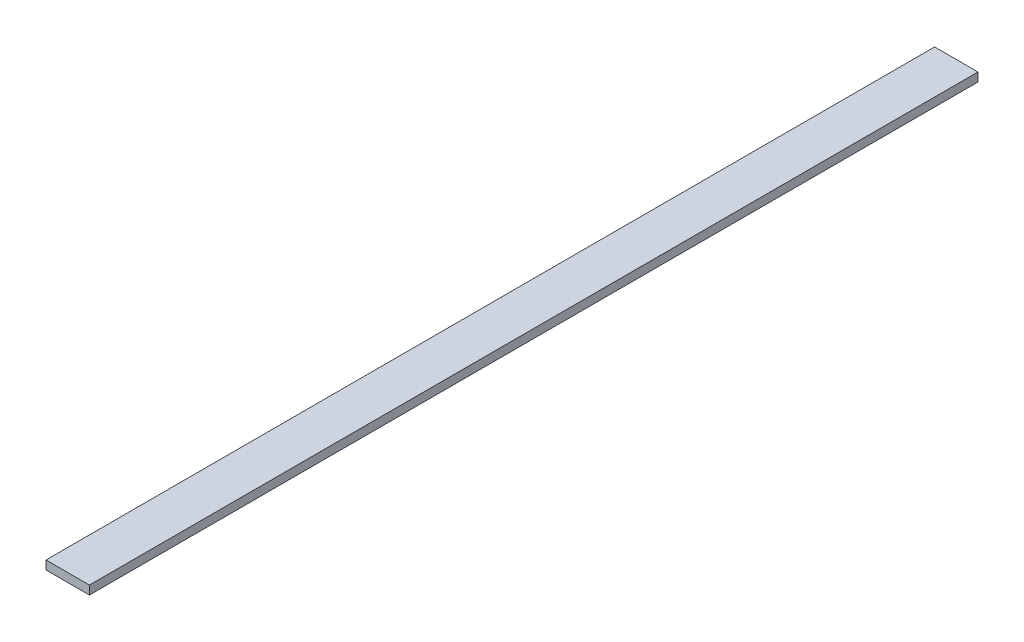
ISO-10303-21;
HEADER;
FILE_DESCRIPTION(('STEP AP214'),'2;1');
FILE_NAME('part.step','',(''),(''),'','','');
FILE_SCHEMA(('AUTOMOTIVE_DESIGN { 1 0 10303 214 1 1 1 1 }'));
ENDSEC;
DATA;
#1=APPLICATION_CONTEXT('core data for automotive mechanical design processes');
#2=APPLICATION_PROTOCOL_DEFINITION('international standard','automotive_design',2000,#1);
#3=PRODUCT_CONTEXT('',#1,'mechanical');
#4=PRODUCT('Part','Part','',(#3));
#5=PRODUCT_RELATED_PRODUCT_CATEGORY('part','',(#4));
#6=PRODUCT_DEFINITION_FORMATION('','',#4);
#7=PRODUCT_DEFINITION_CONTEXT('part definition',#1,'design');
#8=PRODUCT_DEFINITION('design','',#6,#7);
#9=PRODUCT_DEFINITION_SHAPE('','',#8);
#10=(LENGTH_UNIT() NAMED_UNIT(*) SI_UNIT(.MILLI.,.METRE.));
#11=(NAMED_UNIT(*) PLANE_ANGLE_UNIT() SI_UNIT($,.RADIAN.));
#12=(NAMED_UNIT(*) SI_UNIT($,.STERADIAN.) SOLID_ANGLE_UNIT());
#13=UNCERTAINTY_MEASURE_WITH_UNIT(LENGTH_MEASURE(1.E-05),#10,'distance_accuracy_value','');
#14=(GEOMETRIC_REPRESENTATION_CONTEXT(3) GLOBAL_UNCERTAINTY_ASSIGNED_CONTEXT((#13)) GLOBAL_UNIT_ASSIGNED_CONTEXT((#10,
#11,#12)) REPRESENTATION_CONTEXT('',''));
#15=CARTESIAN_POINT('',(0.,0.,0.));
#16=DIRECTION('',(0.,0.,1.));
#17=DIRECTION('',(1.,0.,0.));
#18=AXIS2_PLACEMENT_3D('',#15,#16,#17);
#19=CARTESIAN_POINT('',(9.99999999999997,4.,-204.7875));
#20=DIRECTION('',(-1.,0.,0.));
#21=DIRECTION('',(0.,0.,1.));
#22=AXIS2_PLACEMENT_3D('',#19,#20,#21);
#23=PLANE('',#22);
#24=DIRECTION('',(0.,0.,-1.));
#25=VECTOR('',#24,1.);
#26=CARTESIAN_POINT('',(9.99999999999997,0.,-204.7875));
#27=LINE('',#26,#25);
#28=CARTESIAN_POINT('',(10.,0.,204.7875));
#29=VERTEX_POINT('',#28);
#30=CARTESIAN_POINT('',(9.99999999999997,0.,-204.7875));
#31=VERTEX_POINT('',#30);
#32=EDGE_CURVE('E108',#29,#31,#27,.T.);
#33=ORIENTED_EDGE('',*,*,#32,.T.);
#34=DIRECTION('',(0.,-1.,0.));
#35=VECTOR('',#34,1.);
#36=CARTESIAN_POINT('',(9.99999999999997,4.,-204.7875));
#37=LINE('',#36,#35);
#38=CARTESIAN_POINT('',(9.99999999999997,4.,-204.7875));
#39=VERTEX_POINT('',#38);
#40=EDGE_CURVE('E11',#39,#31,#37,.T.);
#41=ORIENTED_EDGE('',*,*,#40,.F.);
#42=DIRECTION('',(0.,0.,-1.));
#43=VECTOR('',#42,1.);
#44=CARTESIAN_POINT('',(9.99999999999997,4.,-204.7875));
#45=LINE('',#44,#43);
#46=CARTESIAN_POINT('',(10.,4.,204.7875));
#47=VERTEX_POINT('',#46);
#48=EDGE_CURVE('E96',#47,#39,#45,.T.);
#49=ORIENTED_EDGE('',*,*,#48,.F.);
#50=DIRECTION('',(0.,-1.,0.));
#51=VECTOR('',#50,1.);
#52=CARTESIAN_POINT('',(10.,4.,204.7875));
#53=LINE('',#52,#51);
#54=EDGE_CURVE('E104',#47,#29,#53,.T.);
#55=ORIENTED_EDGE('',*,*,#54,.T.);
#56=EDGE_LOOP('',(#33,#41,#49,#55));
#57=FACE_BOUND('',#56,.T.);
#58=ADVANCED_FACE('F45',(#57),#23,.F.);
#59=CARTESIAN_POINT('',(-10.,4.,-204.7875));
#60=DIRECTION('',(0.,0.,1.));
#61=DIRECTION('',(1.,0.,0.));
#62=AXIS2_PLACEMENT_3D('',#59,#60,#61);
#63=PLANE('',#62);
#64=DIRECTION('',(-1.,0.,0.));
#65=VECTOR('',#64,1.);
#66=CARTESIAN_POINT('',(-10.,0.,-204.7875));
#67=LINE('',#66,#65);
#68=CARTESIAN_POINT('',(-10.,0.,-204.7875));
#69=VERTEX_POINT('',#68);
#70=EDGE_CURVE('E100',#31,#69,#67,.T.);
#71=ORIENTED_EDGE('',*,*,#70,.T.);
#72=DIRECTION('',(0.,-1.,0.));
#73=VECTOR('',#72,1.);
#74=CARTESIAN_POINT('',(-10.,4.,-204.7875));
#75=LINE('',#74,#73);
#76=CARTESIAN_POINT('',(-10.,4.,-204.7875));
#77=VERTEX_POINT('',#76);
#78=EDGE_CURVE('E53',#77,#69,#75,.T.);
#79=ORIENTED_EDGE('',*,*,#78,.F.);
#80=DIRECTION('',(-1.,0.,0.));
#81=VECTOR('',#80,1.);
#82=CARTESIAN_POINT('',(-10.,4.,-204.7875));
#83=LINE('',#82,#81);
#84=EDGE_CURVE('E91',#39,#77,#83,.T.);
#85=ORIENTED_EDGE('',*,*,#84,.F.);
#86=ORIENTED_EDGE('',*,*,#40,.T.);
#87=EDGE_LOOP('',(#71,#79,#85,#86));
#88=FACE_BOUND('',#87,.T.);
#89=ADVANCED_FACE('F99',(#88),#63,.F.);
#90=CARTESIAN_POINT('',(-10.,4.,-204.7875));
#91=DIRECTION('',(1.,0.,0.));
#92=DIRECTION('',(0.,0.,-1.));
#93=AXIS2_PLACEMENT_3D('',#90,#91,#92);
#94=PLANE('',#93);
#95=DIRECTION('',(0.,0.,1.));
#96=VECTOR('',#95,1.);
#97=CARTESIAN_POINT('',(-10.,0.,-204.7875));
#98=LINE('',#97,#96);
#99=CARTESIAN_POINT('',(-9.99999999999998,0.,204.7875));
#100=VERTEX_POINT('',#99);
#101=EDGE_CURVE('E78',#69,#100,#98,.T.);
#102=ORIENTED_EDGE('',*,*,#101,.T.);
#103=DIRECTION('',(0.,-1.,0.));
#104=VECTOR('',#103,1.);
#105=CARTESIAN_POINT('',(-9.99999999999998,4.,204.7875));
#106=LINE('',#105,#104);
#107=CARTESIAN_POINT('',(-9.99999999999998,4.,204.7875));
#108=VERTEX_POINT('',#107);
#109=EDGE_CURVE('E101',#108,#100,#106,.T.);
#110=ORIENTED_EDGE('',*,*,#109,.F.);
#111=DIRECTION('',(0.,0.,1.));
#112=VECTOR('',#111,1.);
#113=CARTESIAN_POINT('',(-10.,4.,-204.7875));
#114=LINE('',#113,#112);
#115=EDGE_CURVE('E94',#77,#108,#114,.T.);
#116=ORIENTED_EDGE('',*,*,#115,.F.);
#117=ORIENTED_EDGE('',*,*,#78,.T.);
#118=EDGE_LOOP('',(#102,#110,#116,#117));
#119=FACE_BOUND('',#118,.T.);
#120=ADVANCED_FACE('F102',(#119),#94,.F.);
#121=CARTESIAN_POINT('',(-9.99999999999998,4.,204.7875));
#122=DIRECTION('',(0.,0.,-1.));
#123=DIRECTION('',(-1.,0.,0.));
#124=AXIS2_PLACEMENT_3D('',#121,#122,#123);
#125=PLANE('',#124);
#126=DIRECTION('',(1.,0.,0.));
#127=VECTOR('',#126,1.);
#128=CARTESIAN_POINT('',(-9.99999999999998,0.,204.7875));
#129=LINE('',#128,#127);
#130=EDGE_CURVE('E84',#100,#29,#129,.T.);
#131=ORIENTED_EDGE('',*,*,#130,.T.);
#132=ORIENTED_EDGE('',*,*,#54,.F.);
#133=DIRECTION('',(1.,0.,0.));
#134=VECTOR('',#133,1.);
#135=CARTESIAN_POINT('',(-9.99999999999998,4.,204.7875));
#136=LINE('',#135,#134);
#137=EDGE_CURVE('E61',#108,#47,#136,.T.);
#138=ORIENTED_EDGE('',*,*,#137,.F.);
#139=ORIENTED_EDGE('',*,*,#109,.T.);
#140=EDGE_LOOP('',(#131,#132,#138,#139));
#141=FACE_BOUND('',#140,.T.);
#142=ADVANCED_FACE('F115',(#141),#125,.F.);
#143=CARTESIAN_POINT('',(0.,4.,0.));
#144=DIRECTION('',(0.,1.,0.));
#145=DIRECTION('',(0.,0.,1.));
#146=AXIS2_PLACEMENT_3D('',#143,#144,#145);
#147=PLANE('',#146);
#148=ORIENTED_EDGE('',*,*,#48,.T.);
#149=ORIENTED_EDGE('',*,*,#84,.T.);
#150=ORIENTED_EDGE('',*,*,#115,.T.);
#151=ORIENTED_EDGE('',*,*,#137,.T.);
#152=EDGE_LOOP('',(#148,#149,#150,#151));
#153=FACE_BOUND('',#152,.T.);
#154=ADVANCED_FACE('F92',(#153),#147,.T.);
#155=CARTESIAN_POINT('',(0.,0.,0.));
#156=DIRECTION('',(0.,1.,0.));
#157=DIRECTION('',(0.,0.,1.));
#158=AXIS2_PLACEMENT_3D('',#155,#156,#157);
#159=PLANE('',#158);
#160=ORIENTED_EDGE('',*,*,#32,.F.);
#161=ORIENTED_EDGE('',*,*,#130,.F.);
#162=ORIENTED_EDGE('',*,*,#101,.F.);
#163=ORIENTED_EDGE('',*,*,#70,.F.);
#164=EDGE_LOOP('',(#160,#161,#162,#163));
#165=FACE_BOUND('',#164,.T.);
#166=ADVANCED_FACE('F118',(#165),#159,.F.);
#167=CLOSED_SHELL('',(#58,#89,#120,#142,#154,#166));
#168=MANIFOLD_SOLID_BREP('B2',#167);
#169=ADVANCED_BREP_SHAPE_REPRESENTATION('',(#18,#168),#14);
#170=SHAPE_DEFINITION_REPRESENTATION(#9,#169);
ENDSEC;
END-ISO-10303-21;
